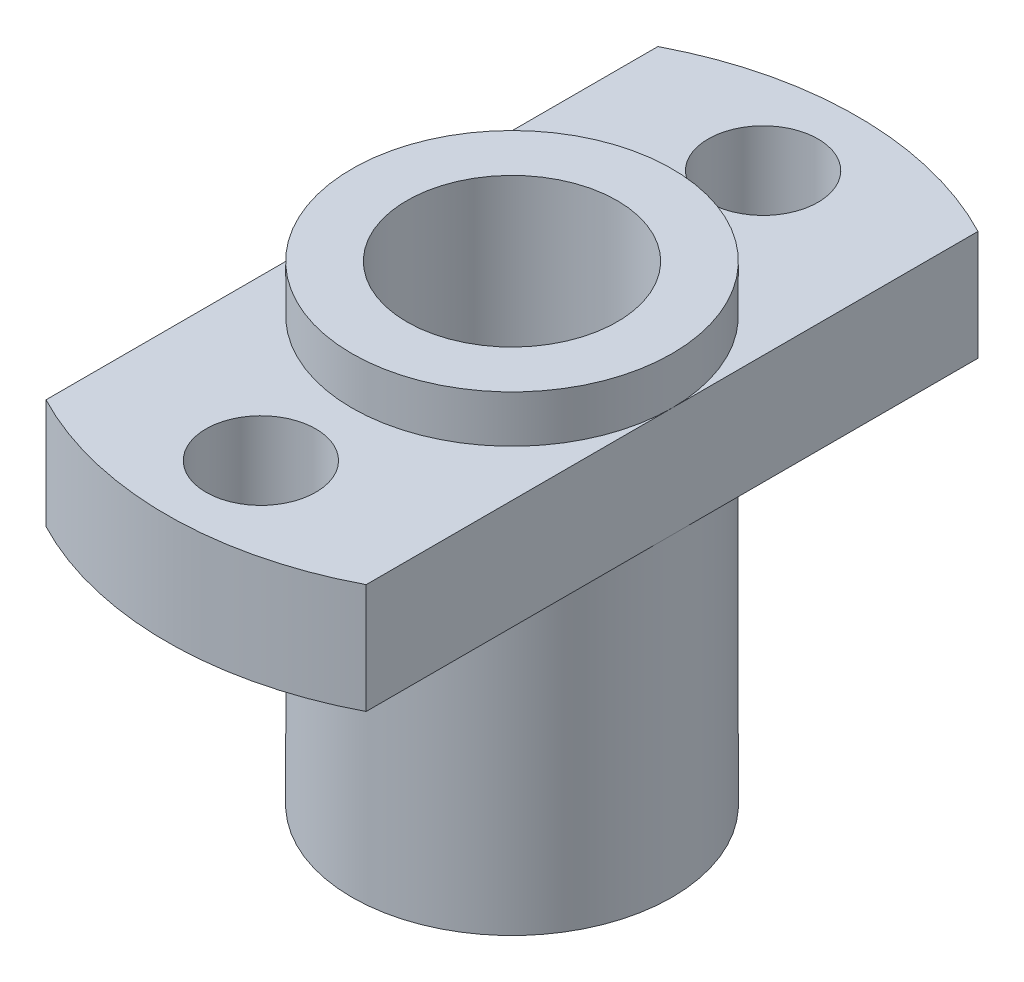
ISO-10303-21;
HEADER;
FILE_DESCRIPTION(('STEP AP214'),'2;1');
FILE_NAME('part.step','',(''),(''),'','','');
FILE_SCHEMA(('AUTOMOTIVE_DESIGN { 1 0 10303 214 1 1 1 1 }'));
ENDSEC;
DATA;
#1=APPLICATION_CONTEXT('core data for automotive mechanical design processes');
#2=APPLICATION_PROTOCOL_DEFINITION('international standard','automotive_design',2000,#1);
#3=PRODUCT_CONTEXT('',#1,'mechanical');
#4=PRODUCT('Part','Part','',(#3));
#5=PRODUCT_RELATED_PRODUCT_CATEGORY('part','',(#4));
#6=PRODUCT_DEFINITION_FORMATION('','',#4);
#7=PRODUCT_DEFINITION_CONTEXT('part definition',#1,'design');
#8=PRODUCT_DEFINITION('design','',#6,#7);
#9=PRODUCT_DEFINITION_SHAPE('','',#8);
#10=(LENGTH_UNIT() NAMED_UNIT(*) SI_UNIT(.MILLI.,.METRE.));
#11=(NAMED_UNIT(*) PLANE_ANGLE_UNIT() SI_UNIT($,.RADIAN.));
#12=(NAMED_UNIT(*) SI_UNIT($,.STERADIAN.) SOLID_ANGLE_UNIT());
#13=UNCERTAINTY_MEASURE_WITH_UNIT(LENGTH_MEASURE(1.E-05),#10,'distance_accuracy_value','');
#14=(GEOMETRIC_REPRESENTATION_CONTEXT(3) GLOBAL_UNCERTAINTY_ASSIGNED_CONTEXT((#13)) GLOBAL_UNIT_ASSIGNED_CONTEXT((#10,
#11,#12)) REPRESENTATION_CONTEXT('',''));
#15=CARTESIAN_POINT('',(0.,0.,0.));
#16=DIRECTION('',(0.,0.,1.));
#17=DIRECTION('',(1.,0.,0.));
#18=AXIS2_PLACEMENT_3D('',#15,#16,#17);
#19=CARTESIAN_POINT('',(0.,15.,0.));
#20=DIRECTION('',(0.,-1.,0.));
#21=DIRECTION('',(0.,0.,-1.));
#22=AXIS2_PLACEMENT_3D('',#19,#20,#21);
#23=CYLINDRICAL_SURFACE('',#22,5.1);
#24=CARTESIAN_POINT('',(0.,0.,0.));
#25=DIRECTION('',(0.,1.,0.));
#26=DIRECTION('',(0.,0.,1.));
#27=AXIS2_PLACEMENT_3D('',#24,#25,#26);
#28=CIRCLE('',#27,5.1);
#29=CARTESIAN_POINT('',(0.,0.,5.1));
#30=VERTEX_POINT('',#29);
#31=EDGE_CURVE('E138',#30,#30,#28,.T.);
#32=ORIENTED_EDGE('',*,*,#31,.T.);
#33=EDGE_LOOP('',(#32));
#34=FACE_BOUND('',#33,.T.);
#35=CARTESIAN_POINT('',(0.,10.,0.));
#36=DIRECTION('',(0.,1.,0.));
#37=DIRECTION('',(0.,0.,1.));
#38=AXIS2_PLACEMENT_3D('',#35,#36,#37);
#39=CIRCLE('',#38,5.1);
#40=CARTESIAN_POINT('',(5.1,10.,0.));
#41=VERTEX_POINT('',#40);
#42=CARTESIAN_POINT('',(-5.1,10.,0.));
#43=VERTEX_POINT('',#42);
#44=EDGE_CURVE('E11',#41,#43,#39,.T.);
#45=ORIENTED_EDGE('',*,*,#44,.F.);
#46=EDGE_CURVE('E45',#43,#41,#39,.T.);
#47=ORIENTED_EDGE('',*,*,#46,.F.);
#48=EDGE_LOOP('',(#45,#47));
#49=FACE_BOUND('',#48,.T.);
#50=ADVANCED_FACE('F41',(#34,#49),#23,.T.);
#51=CARTESIAN_POINT('',(0.,0.,0.));
#52=DIRECTION('',(0.,1.,0.));
#53=DIRECTION('',(0.,0.,1.));
#54=AXIS2_PLACEMENT_3D('',#51,#52,#53);
#55=PLANE('',#54);
#56=CARTESIAN_POINT('',(0.,0.,0.));
#57=DIRECTION('',(0.,1.,0.));
#58=DIRECTION('',(0.,0.,1.));
#59=AXIS2_PLACEMENT_3D('',#56,#57,#58);
#60=CIRCLE('',#59,3.35);
#61=CARTESIAN_POINT('',(0.,0.,3.35));
#62=VERTEX_POINT('',#61);
#63=EDGE_CURVE('E172',#62,#62,#60,.T.);
#64=ORIENTED_EDGE('',*,*,#63,.T.);
#65=EDGE_LOOP('',(#64));
#66=FACE_BOUND('',#65,.T.);
#67=ORIENTED_EDGE('',*,*,#31,.F.);
#68=EDGE_LOOP('',(#67));
#69=FACE_BOUND('',#68,.T.);
#70=ADVANCED_FACE('F197',(#66,#69),#55,.F.);
#71=CARTESIAN_POINT('',(-5.1,10.,-9.74628134213249));
#72=DIRECTION('',(-1.,0.,0.));
#73=DIRECTION('',(0.,0.,1.));
#74=AXIS2_PLACEMENT_3D('',#71,#72,#73);
#75=PLANE('',#74);
#76=DIRECTION('',(0.,0.,1.));
#77=VECTOR('',#76,1.);
#78=CARTESIAN_POINT('',(-5.1,10.,-9.74628134213249));
#79=LINE('',#78,#77);
#80=CARTESIAN_POINT('',(-5.1,10.,-9.74628134213249));
#81=VERTEX_POINT('',#80);
#82=EDGE_CURVE('E100',#81,#43,#79,.T.);
#83=ORIENTED_EDGE('',*,*,#82,.T.);
#84=CARTESIAN_POINT('',(-5.1,10.,9.74628134213249));
#85=VERTEX_POINT('',#84);
#86=EDGE_CURVE('E126',#43,#85,#79,.T.);
#87=ORIENTED_EDGE('',*,*,#86,.T.);
#88=DIRECTION('',(0.,1.,0.));
#89=VECTOR('',#88,1.);
#90=CARTESIAN_POINT('',(-5.1,10.,9.74628134213249));
#91=LINE('',#90,#89);
#92=CARTESIAN_POINT('',(-5.1,13.5,9.74628134213249));
#93=VERTEX_POINT('',#92);
#94=EDGE_CURVE('E114',#85,#93,#91,.T.);
#95=ORIENTED_EDGE('',*,*,#94,.T.);
#96=DIRECTION('',(0.,0.,1.));
#97=VECTOR('',#96,1.);
#98=CARTESIAN_POINT('',(-5.1,13.5,-9.74628134213249));
#99=LINE('',#98,#97);
#100=CARTESIAN_POINT('',(-5.1,13.5,0.));
#101=VERTEX_POINT('',#100);
#102=EDGE_CURVE('E118',#101,#93,#99,.T.);
#103=ORIENTED_EDGE('',*,*,#102,.F.);
#104=CARTESIAN_POINT('',(-5.1,13.5,-9.74628134213249));
#105=VERTEX_POINT('',#104);
#106=EDGE_CURVE('E115',#105,#101,#99,.T.);
#107=ORIENTED_EDGE('',*,*,#106,.F.);
#108=DIRECTION('',(0.,1.,0.));
#109=VECTOR('',#108,1.);
#110=CARTESIAN_POINT('',(-5.1,10.,-9.74628134213249));
#111=LINE('',#110,#109);
#112=EDGE_CURVE('E139',#81,#105,#111,.T.);
#113=ORIENTED_EDGE('',*,*,#112,.F.);
#114=EDGE_LOOP('',(#83,#87,#95,#103,#107,#113));
#115=FACE_BOUND('',#114,.T.);
#116=ADVANCED_FACE('F161',(#115),#75,.T.);
#117=CARTESIAN_POINT('',(5.1,10.,-9.74628134213249));
#118=DIRECTION('',(1.,0.,0.));
#119=DIRECTION('',(0.,0.,-1.));
#120=AXIS2_PLACEMENT_3D('',#117,#118,#119);
#121=PLANE('',#120);
#122=DIRECTION('',(0.,0.,-1.));
#123=VECTOR('',#122,1.);
#124=CARTESIAN_POINT('',(5.1,10.,-9.74628134213249));
#125=LINE('',#124,#123);
#126=CARTESIAN_POINT('',(5.1,10.,9.74628134213249));
#127=VERTEX_POINT('',#126);
#128=EDGE_CURVE('E95',#127,#41,#125,.T.);
#129=ORIENTED_EDGE('',*,*,#128,.T.);
#130=CARTESIAN_POINT('',(5.1,10.,-9.74628134213249));
#131=VERTEX_POINT('',#130);
#132=EDGE_CURVE('E109',#41,#131,#125,.T.);
#133=ORIENTED_EDGE('',*,*,#132,.T.);
#134=DIRECTION('',(0.,1.,0.));
#135=VECTOR('',#134,1.);
#136=CARTESIAN_POINT('',(5.1,10.,-9.74628134213249));
#137=LINE('',#136,#135);
#138=CARTESIAN_POINT('',(5.1,13.5,-9.74628134213249));
#139=VERTEX_POINT('',#138);
#140=EDGE_CURVE('E99',#131,#139,#137,.T.);
#141=ORIENTED_EDGE('',*,*,#140,.T.);
#142=DIRECTION('',(0.,0.,-1.));
#143=VECTOR('',#142,1.);
#144=CARTESIAN_POINT('',(5.1,13.5,-9.74628134213249));
#145=LINE('',#144,#143);
#146=CARTESIAN_POINT('',(5.1,13.5,0.));
#147=VERTEX_POINT('',#146);
#148=EDGE_CURVE('E131',#147,#139,#145,.T.);
#149=ORIENTED_EDGE('',*,*,#148,.F.);
#150=CARTESIAN_POINT('',(5.1,13.5,9.74628134213249));
#151=VERTEX_POINT('',#150);
#152=EDGE_CURVE('E61',#151,#147,#145,.T.);
#153=ORIENTED_EDGE('',*,*,#152,.F.);
#154=DIRECTION('',(0.,1.,0.));
#155=VECTOR('',#154,1.);
#156=CARTESIAN_POINT('',(5.1,10.,9.74628134213249));
#157=LINE('',#156,#155);
#158=EDGE_CURVE('E92',#127,#151,#157,.T.);
#159=ORIENTED_EDGE('',*,*,#158,.F.);
#160=EDGE_LOOP('',(#129,#133,#141,#149,#153,#159));
#161=FACE_BOUND('',#160,.T.);
#162=ADVANCED_FACE('F94',(#161),#121,.T.);
#163=CARTESIAN_POINT('',(0.,10.,0.));
#164=DIRECTION('',(0.,1.,0.));
#165=DIRECTION('',(0.,0.,1.));
#166=AXIS2_PLACEMENT_3D('',#163,#164,#165);
#167=PLANE('',#166);
#168=CARTESIAN_POINT('',(0.,10.,-8.));
#169=DIRECTION('',(0.,1.,0.));
#170=DIRECTION('',(0.,0.,1.));
#171=AXIS2_PLACEMENT_3D('',#168,#169,#170);
#172=CIRCLE('',#171,1.75);
#173=CARTESIAN_POINT('',(0.,10.,-6.25));
#174=VERTEX_POINT('',#173);
#175=EDGE_CURVE('E132',#174,#174,#172,.T.);
#176=ORIENTED_EDGE('',*,*,#175,.T.);
#177=EDGE_LOOP('',(#176));
#178=FACE_BOUND('',#177,.T.);
#179=ORIENTED_EDGE('',*,*,#132,.F.);
#180=ORIENTED_EDGE('',*,*,#44,.T.);
#181=ORIENTED_EDGE('',*,*,#82,.F.);
#182=CARTESIAN_POINT('',(0.,10.,0.));
#183=DIRECTION('',(0.,1.,0.));
#184=DIRECTION('',(0.,0.,1.));
#185=AXIS2_PLACEMENT_3D('',#182,#183,#184);
#186=CIRCLE('',#185,11.);
#187=EDGE_CURVE('E108',#131,#81,#186,.T.);
#188=ORIENTED_EDGE('',*,*,#187,.F.);
#189=EDGE_LOOP('',(#179,#180,#181,#188));
#190=FACE_BOUND('',#189,.T.);
#191=ADVANCED_FACE('F187',(#178,#190),#167,.F.);
#192=CARTESIAN_POINT('',(0.,13.5,0.));
#193=DIRECTION('',(0.,1.,0.));
#194=DIRECTION('',(0.,0.,1.));
#195=AXIS2_PLACEMENT_3D('',#192,#193,#194);
#196=PLANE('',#195);
#197=CARTESIAN_POINT('',(0.,13.5,0.));
#198=DIRECTION('',(0.,1.,0.));
#199=DIRECTION('',(0.,0.,1.));
#200=AXIS2_PLACEMENT_3D('',#197,#198,#199);
#201=CIRCLE('',#200,5.1);
#202=EDGE_CURVE('E149',#147,#101,#201,.T.);
#203=ORIENTED_EDGE('',*,*,#202,.F.);
#204=ORIENTED_EDGE('',*,*,#148,.T.);
#205=CARTESIAN_POINT('',(0.,13.5,0.));
#206=DIRECTION('',(0.,1.,0.));
#207=DIRECTION('',(0.,0.,1.));
#208=AXIS2_PLACEMENT_3D('',#205,#206,#207);
#209=CIRCLE('',#208,11.);
#210=EDGE_CURVE('E134',#139,#105,#209,.T.);
#211=ORIENTED_EDGE('',*,*,#210,.T.);
#212=ORIENTED_EDGE('',*,*,#106,.T.);
#213=EDGE_LOOP('',(#203,#204,#211,#212));
#214=FACE_BOUND('',#213,.T.);
#215=CARTESIAN_POINT('',(0.,13.5,-8.));
#216=DIRECTION('',(0.,1.,0.));
#217=DIRECTION('',(0.,0.,1.));
#218=AXIS2_PLACEMENT_3D('',#215,#216,#217);
#219=CIRCLE('',#218,1.75);
#220=CARTESIAN_POINT('',(0.,13.5,-6.25));
#221=VERTEX_POINT('',#220);
#222=EDGE_CURVE('E121',#221,#221,#219,.T.);
#223=ORIENTED_EDGE('',*,*,#222,.F.);
#224=EDGE_LOOP('',(#223));
#225=FACE_BOUND('',#224,.T.);
#226=ADVANCED_FACE('F155',(#214,#225),#196,.T.);
#227=CARTESIAN_POINT('',(0.,10.,0.));
#228=DIRECTION('',(0.,1.,0.));
#229=DIRECTION('',(0.,0.,1.));
#230=AXIS2_PLACEMENT_3D('',#227,#228,#229);
#231=CYLINDRICAL_SURFACE('',#230,11.);
#232=CARTESIAN_POINT('',(0.,13.5,0.));
#233=DIRECTION('',(0.,1.,0.));
#234=DIRECTION('',(0.,0.,1.));
#235=AXIS2_PLACEMENT_3D('',#232,#233,#234);
#236=CIRCLE('',#235,11.);
#237=EDGE_CURVE('E129',#93,#151,#236,.T.);
#238=ORIENTED_EDGE('',*,*,#237,.F.);
#239=ORIENTED_EDGE('',*,*,#94,.F.);
#240=CARTESIAN_POINT('',(0.,10.,0.));
#241=DIRECTION('',(0.,1.,0.));
#242=DIRECTION('',(0.,0.,1.));
#243=AXIS2_PLACEMENT_3D('',#240,#241,#242);
#244=CIRCLE('',#243,11.);
#245=EDGE_CURVE('E106',#85,#127,#244,.T.);
#246=ORIENTED_EDGE('',*,*,#245,.T.);
#247=ORIENTED_EDGE('',*,*,#158,.T.);
#248=EDGE_LOOP('',(#238,#239,#246,#247));
#249=FACE_BOUND('',#248,.T.);
#250=ADVANCED_FACE('F112',(#249),#231,.T.);
#251=CARTESIAN_POINT('',(0.,10.,0.));
#252=DIRECTION('',(0.,1.,0.));
#253=DIRECTION('',(0.,0.,1.));
#254=AXIS2_PLACEMENT_3D('',#251,#252,#253);
#255=CYLINDRICAL_SURFACE('',#254,11.);
#256=ORIENTED_EDGE('',*,*,#210,.F.);
#257=ORIENTED_EDGE('',*,*,#140,.F.);
#258=ORIENTED_EDGE('',*,*,#187,.T.);
#259=ORIENTED_EDGE('',*,*,#112,.T.);
#260=EDGE_LOOP('',(#256,#257,#258,#259));
#261=FACE_BOUND('',#260,.T.);
#262=ADVANCED_FACE('F192',(#261),#255,.T.);
#263=CARTESIAN_POINT('',(0.,10.,8.));
#264=DIRECTION('',(0.,1.,0.));
#265=DIRECTION('',(0.,0.,1.));
#266=AXIS2_PLACEMENT_3D('',#263,#264,#265);
#267=CIRCLE('',#266,1.75);
#268=CARTESIAN_POINT('',(0.,10.,9.75));
#269=VERTEX_POINT('',#268);
#270=EDGE_CURVE('E171',#269,#269,#267,.T.);
#271=ORIENTED_EDGE('',*,*,#270,.T.);
#272=EDGE_LOOP('',(#271));
#273=FACE_BOUND('',#272,.T.);
#274=ORIENTED_EDGE('',*,*,#86,.F.);
#275=ORIENTED_EDGE('',*,*,#46,.T.);
#276=ORIENTED_EDGE('',*,*,#128,.F.);
#277=ORIENTED_EDGE('',*,*,#245,.F.);
#278=EDGE_LOOP('',(#274,#275,#276,#277));
#279=FACE_BOUND('',#278,.T.);
#280=ADVANCED_FACE('F105',(#273,#279),#167,.F.);
#281=EDGE_CURVE('E146',#101,#147,#201,.T.);
#282=ORIENTED_EDGE('',*,*,#281,.F.);
#283=ORIENTED_EDGE('',*,*,#102,.T.);
#284=ORIENTED_EDGE('',*,*,#237,.T.);
#285=ORIENTED_EDGE('',*,*,#152,.T.);
#286=EDGE_LOOP('',(#282,#283,#284,#285));
#287=FACE_BOUND('',#286,.T.);
#288=CARTESIAN_POINT('',(0.,13.5,8.));
#289=DIRECTION('',(0.,1.,0.));
#290=DIRECTION('',(0.,0.,1.));
#291=AXIS2_PLACEMENT_3D('',#288,#289,#290);
#292=CIRCLE('',#291,1.75);
#293=CARTESIAN_POINT('',(0.,13.5,9.75));
#294=VERTEX_POINT('',#293);
#295=EDGE_CURVE('E169',#294,#294,#292,.T.);
#296=ORIENTED_EDGE('',*,*,#295,.F.);
#297=EDGE_LOOP('',(#296));
#298=FACE_BOUND('',#297,.T.);
#299=ADVANCED_FACE('F162',(#287,#298),#196,.T.);
#300=CARTESIAN_POINT('',(0.,10.,-8.));
#301=DIRECTION('',(0.,1.,0.));
#302=DIRECTION('',(0.,0.,1.));
#303=AXIS2_PLACEMENT_3D('',#300,#301,#302);
#304=CYLINDRICAL_SURFACE('',#303,1.75);
#305=ORIENTED_EDGE('',*,*,#175,.F.);
#306=EDGE_LOOP('',(#305));
#307=FACE_BOUND('',#306,.T.);
#308=ORIENTED_EDGE('',*,*,#222,.T.);
#309=EDGE_LOOP('',(#308));
#310=FACE_BOUND('',#309,.T.);
#311=ADVANCED_FACE('F165',(#307,#310),#304,.F.);
#312=CARTESIAN_POINT('',(0.,10.,8.));
#313=DIRECTION('',(0.,1.,0.));
#314=DIRECTION('',(0.,0.,1.));
#315=AXIS2_PLACEMENT_3D('',#312,#313,#314);
#316=CYLINDRICAL_SURFACE('',#315,1.75);
#317=ORIENTED_EDGE('',*,*,#270,.F.);
#318=EDGE_LOOP('',(#317));
#319=FACE_BOUND('',#318,.T.);
#320=ORIENTED_EDGE('',*,*,#295,.T.);
#321=EDGE_LOOP('',(#320));
#322=FACE_BOUND('',#321,.T.);
#323=ADVANCED_FACE('F212',(#319,#322),#316,.F.);
#324=CARTESIAN_POINT('',(0.,15.,0.));
#325=DIRECTION('',(0.,1.,0.));
#326=DIRECTION('',(0.,0.,1.));
#327=AXIS2_PLACEMENT_3D('',#324,#325,#326);
#328=PLANE('',#327);
#329=CARTESIAN_POINT('',(0.,15.,0.));
#330=DIRECTION('',(0.,1.,0.));
#331=DIRECTION('',(0.,0.,1.));
#332=AXIS2_PLACEMENT_3D('',#329,#330,#331);
#333=CIRCLE('',#332,3.35);
#334=CARTESIAN_POINT('',(0.,15.,3.35));
#335=VERTEX_POINT('',#334);
#336=EDGE_CURVE('E177',#335,#335,#333,.T.);
#337=ORIENTED_EDGE('',*,*,#336,.F.);
#338=EDGE_LOOP('',(#337));
#339=FACE_BOUND('',#338,.T.);
#340=CARTESIAN_POINT('',(0.,15.,0.));
#341=DIRECTION('',(0.,1.,0.));
#342=DIRECTION('',(0.,0.,1.));
#343=AXIS2_PLACEMENT_3D('',#340,#341,#342);
#344=CIRCLE('',#343,5.1);
#345=CARTESIAN_POINT('',(0.,15.,5.1));
#346=VERTEX_POINT('',#345);
#347=EDGE_CURVE('E143',#346,#346,#344,.T.);
#348=ORIENTED_EDGE('',*,*,#347,.T.);
#349=EDGE_LOOP('',(#348));
#350=FACE_BOUND('',#349,.T.);
#351=ADVANCED_FACE('F205',(#339,#350),#328,.T.);
#352=ORIENTED_EDGE('',*,*,#281,.T.);
#353=ORIENTED_EDGE('',*,*,#202,.T.);
#354=EDGE_LOOP('',(#352,#353));
#355=FACE_BOUND('',#354,.T.);
#356=ORIENTED_EDGE('',*,*,#347,.F.);
#357=EDGE_LOOP('',(#356));
#358=FACE_BOUND('',#357,.T.);
#359=ADVANCED_FACE('F43',(#355,#358),#23,.T.);
#360=CARTESIAN_POINT('',(0.,0.,0.));
#361=DIRECTION('',(0.,1.,0.));
#362=DIRECTION('',(0.,0.,1.));
#363=AXIS2_PLACEMENT_3D('',#360,#361,#362);
#364=CYLINDRICAL_SURFACE('',#363,3.35);
#365=ORIENTED_EDGE('',*,*,#63,.F.);
#366=EDGE_LOOP('',(#365));
#367=FACE_BOUND('',#366,.T.);
#368=ORIENTED_EDGE('',*,*,#336,.T.);
#369=EDGE_LOOP('',(#368));
#370=FACE_BOUND('',#369,.T.);
#371=ADVANCED_FACE('F204',(#367,#370),#364,.F.);
#372=CLOSED_SHELL('',(#50,#70,#116,#162,#191,#226,#250,#262,#280,#299,#311,#323,#351,#359,#371));
#373=MANIFOLD_SOLID_BREP('B2',#372);
#374=ADVANCED_BREP_SHAPE_REPRESENTATION('',(#18,#373),#14);
#375=SHAPE_DEFINITION_REPRESENTATION(#9,#374);
ENDSEC;
END-ISO-10303-21;
